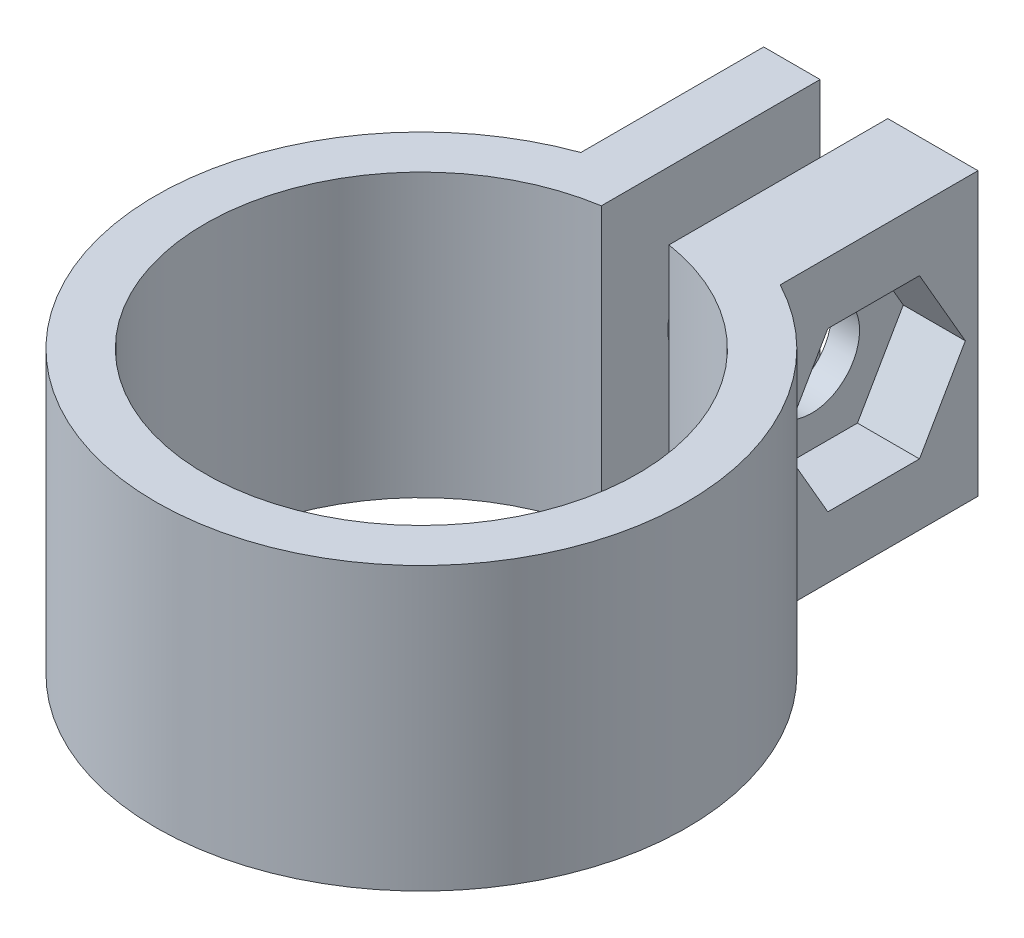
ISO-10303-21;
HEADER;
FILE_DESCRIPTION(('STEP AP214'),'2;1');
FILE_NAME('part.step','',(''),(''),'','','');
FILE_SCHEMA(('AUTOMOTIVE_DESIGN { 1 0 10303 214 1 1 1 1 }'));
ENDSEC;
DATA;
#1=APPLICATION_CONTEXT('core data for automotive mechanical design processes');
#2=APPLICATION_PROTOCOL_DEFINITION('international standard','automotive_design',2000,#1);
#3=PRODUCT_CONTEXT('',#1,'mechanical');
#4=PRODUCT('Part','Part','',(#3));
#5=PRODUCT_RELATED_PRODUCT_CATEGORY('part','',(#4));
#6=PRODUCT_DEFINITION_FORMATION('','',#4);
#7=PRODUCT_DEFINITION_CONTEXT('part definition',#1,'design');
#8=PRODUCT_DEFINITION('design','',#6,#7);
#9=PRODUCT_DEFINITION_SHAPE('','',#8);
#10=(LENGTH_UNIT() NAMED_UNIT(*) SI_UNIT(.MILLI.,.METRE.));
#11=(NAMED_UNIT(*) PLANE_ANGLE_UNIT() SI_UNIT($,.RADIAN.));
#12=(NAMED_UNIT(*) SI_UNIT($,.STERADIAN.) SOLID_ANGLE_UNIT());
#13=UNCERTAINTY_MEASURE_WITH_UNIT(LENGTH_MEASURE(1.E-05),#10,'distance_accuracy_value','');
#14=(GEOMETRIC_REPRESENTATION_CONTEXT(3) GLOBAL_UNCERTAINTY_ASSIGNED_CONTEXT((#13)) GLOBAL_UNIT_ASSIGNED_CONTEXT((#10,
#11,#12)) REPRESENTATION_CONTEXT('',''));
#15=CARTESIAN_POINT('',(0.,0.,0.));
#16=DIRECTION('',(0.,0.,1.));
#17=DIRECTION('',(1.,0.,0.));
#18=AXIS2_PLACEMENT_3D('',#15,#16,#17);
#19=CARTESIAN_POINT('',(0.,10.,0.));
#20=DIRECTION('',(0.,-1.,0.));
#21=DIRECTION('',(0.,0.,-1.));
#22=AXIS2_PLACEMENT_3D('',#19,#20,#21);
#23=CYLINDRICAL_SURFACE('',#22,9.415);
#24=CARTESIAN_POINT('',(-3.20000000000001,3.32266334273869,-8.85450309164777));
#25=CARTESIAN_POINT('',(-3.25054595508457,3.35298669138748,-8.83623795384005));
#26=CARTESIAN_POINT('',(-3.30019469485413,3.38469144272539,-8.81780291396599));
#27=CARTESIAN_POINT('',(-3.39746319620485,3.45111113295641,-8.78078449442234));
#28=CARTESIAN_POINT('',(-3.44508063995582,3.48582938026727,-8.76220097258393));
#29=CARTESIAN_POINT('',(-3.58572829051681,3.59583534816847,-8.70603386733257));
#30=CARTESIAN_POINT('',(-3.67505223024977,3.67609814594171,-8.6685823268921));
#31=CARTESIAN_POINT('',(-3.84078313057335,3.85144043410508,-8.5964435731321));
#32=CARTESIAN_POINT('',(-3.91709612437759,3.94661890671804,-8.56177735286647));
#33=CARTESIAN_POINT('',(-4.05084130179677,4.15084970714731,-8.49931501943328));
#34=CARTESIAN_POINT('',(-4.10839820785032,4.25980340930395,-8.47147384212029));
#35=CARTESIAN_POINT('',(-4.18569686465278,4.4535297664306,-8.43346997560956));
#36=CARTESIAN_POINT('',(-4.21163173927468,4.53529381341501,-8.42050218063141));
#37=CARTESIAN_POINT('',(-4.25088502798286,4.70260523306088,-8.40075550025931));
#38=CARTESIAN_POINT('',(-4.26420125340926,4.78815325934784,-8.39397768850337));
#39=CARTESIAN_POINT('',(-4.2773216553429,4.9607561709968,-8.38730016581237));
#40=CARTESIAN_POINT('',(-4.27709488251861,5.04781405325867,-8.38741620915566));
#41=CARTESIAN_POINT('',(-4.26307259467804,5.2205273333778,-8.39455147824911));
#42=CARTESIAN_POINT('',(-4.24927656546568,5.30618267796196,-8.40157096559973));
#43=CARTESIAN_POINT('',(-4.20970633214485,5.47083014084275,-8.42146413014954));
#44=CARTESIAN_POINT('',(-4.18434985362165,5.54994941980127,-8.43413333687166));
#45=CARTESIAN_POINT('',(-4.12319086115026,5.70301868452758,-8.46419993249979));
#46=CARTESIAN_POINT('',(-4.08738714837581,5.77696807583987,-8.48159786401403));
#47=CARTESIAN_POINT('',(-3.98981859831605,5.94883701376942,-8.52804600478352));
#48=CARTESIAN_POINT('',(-3.92347826198742,6.04366661682908,-8.55891232141778));
#49=CARTESIAN_POINT('',(-3.77684369814997,6.22055497491544,-8.62462461824936));
#50=CARTESIAN_POINT('',(-3.69649933964169,6.30256576989764,-8.6594847361683));
#51=CARTESIAN_POINT('',(-3.54723111918477,6.43494048300563,-8.72147657930072));
#52=CARTESIAN_POINT('',(-3.48057428161443,6.48805702124737,-8.74832759799038));
#53=CARTESIAN_POINT('',(-3.34317937130383,6.58748379960529,-8.80175175459164));
#54=CARTESIAN_POINT('',(-3.27248032209904,6.63384750775786,-8.82832533083191));
#55=CARTESIAN_POINT('',(-3.20000000000001,6.67733665726131,-8.85450309164777));
#56=B_SPLINE_CURVE_WITH_KNOTS('',3,(#24,#25,#26,#27,#28,#29,#30,#31,#32,#33,#34,#35,#36,#37,#38,
#39,#40,#41,#42,#43,#44,#45,#46,#47,#48,#49,#50,#51,#52,#53,#54,#55),.UNSPECIFIED.,.F.,.F.,(4,2,
2,2,2,2,2,2,2,2,2,2,2,2,2,4),(0.,0.1850829611416,0.370371753015485,0.746381534954159,
1.12500137692798,1.50104953977322,1.76022611431609,2.01944763389206,2.2792615657921,
2.53908534351154,2.79018540970542,3.04131430111838,3.39865528012095,3.75730275877797,
4.02504520273249,4.29053666169894),.UNSPECIFIED.);
#57=CARTESIAN_POINT('',(-3.2,3.32266334273869,-8.85450309164778));
#58=VERTEX_POINT('',#57);
#59=CARTESIAN_POINT('',(-3.2,6.67733665726131,-8.85450309164778));
#60=VERTEX_POINT('',#59);
#61=EDGE_CURVE('E162',#58,#60,#56,.T.);
#62=ORIENTED_EDGE('',*,*,#61,.F.);
#63=DIRECTION('',(0.,-1.,0.));
#64=VECTOR('',#63,1.);
#65=CARTESIAN_POINT('',(-3.2,10.,-8.85450309164778));
#66=LINE('',#65,#64);
#67=CARTESIAN_POINT('',(-3.2,0.,-8.85450309164777));
#68=VERTEX_POINT('',#67);
#69=EDGE_CURVE('E13',#68,#58,#66,.F.);
#70=ORIENTED_EDGE('',*,*,#69,.F.);
#71=CARTESIAN_POINT('',(0.,0.,0.));
#72=DIRECTION('',(0.,1.,0.));
#73=DIRECTION('',(1.,0.,0.));
#74=AXIS2_PLACEMENT_3D('',#71,#72,#73);
#75=CIRCLE('',#74,9.415);
#76=CARTESIAN_POINT('',(4.4,0.,-8.32359447594607));
#77=VERTEX_POINT('',#76);
#78=EDGE_CURVE('E221',#68,#77,#75,.T.);
#79=ORIENTED_EDGE('',*,*,#78,.T.);
#80=DIRECTION('',(0.,-1.,0.));
#81=VECTOR('',#80,1.);
#82=CARTESIAN_POINT('',(4.4,10.,-8.32359447594607));
#83=LINE('',#82,#81);
#84=CARTESIAN_POINT('',(4.4,10.,-8.32359447594607));
#85=VERTEX_POINT('',#84);
#86=EDGE_CURVE('E197',#85,#77,#83,.T.);
#87=ORIENTED_EDGE('',*,*,#86,.F.);
#88=CARTESIAN_POINT('',(0.,10.,0.));
#89=DIRECTION('',(0.,1.,0.));
#90=DIRECTION('',(1.,0.,0.));
#91=AXIS2_PLACEMENT_3D('',#88,#89,#90);
#92=CIRCLE('',#91,9.415);
#93=CARTESIAN_POINT('',(-3.2,10.,-8.85450309164777));
#94=VERTEX_POINT('',#93);
#95=EDGE_CURVE('E225',#94,#85,#92,.T.);
#96=ORIENTED_EDGE('',*,*,#95,.F.);
#97=EDGE_CURVE('E63',#60,#94,#66,.F.);
#98=ORIENTED_EDGE('',*,*,#97,.F.);
#99=EDGE_LOOP('',(#62,#70,#79,#87,#96,#98));
#100=FACE_BOUND('',#99,.T.);
#101=ADVANCED_FACE('F53',(#100),#23,.T.);
#102=CARTESIAN_POINT('',(-6.8,5.,-11.6382131588436));
#103=DIRECTION('',(1.,0.,0.));
#104=DIRECTION('',(0.,0.,-1.));
#105=AXIS2_PLACEMENT_3D('',#102,#103,#104);
#106=CYLINDRICAL_SURFACE('',#105,1.7);
#107=CARTESIAN_POINT('',(1.2,5.,-11.6382131588436));
#108=DIRECTION('',(1.,0.,0.));
#109=DIRECTION('',(0.,0.,-1.));
#110=AXIS2_PLACEMENT_3D('',#107,#108,#109);
#111=CIRCLE('',#110,1.7);
#112=CARTESIAN_POINT('',(1.2,5.,-13.3382131588436));
#113=VERTEX_POINT('',#112);
#114=EDGE_CURVE('E271',#113,#113,#111,.T.);
#115=ORIENTED_EDGE('',*,*,#114,.F.);
#116=EDGE_LOOP('',(#115));
#117=FACE_BOUND('',#116,.T.);
#118=CARTESIAN_POINT('',(2.2,5.,-11.6382131588436));
#119=DIRECTION('',(1.,0.,0.));
#120=DIRECTION('',(0.,0.,-1.));
#121=AXIS2_PLACEMENT_3D('',#118,#119,#120);
#122=CIRCLE('',#121,1.7);
#123=CARTESIAN_POINT('',(2.2,5.,-13.3382131588436));
#124=VERTEX_POINT('',#123);
#125=EDGE_CURVE('E57',#124,#124,#122,.F.);
#126=ORIENTED_EDGE('',*,*,#125,.F.);
#127=EDGE_LOOP('',(#126));
#128=FACE_BOUND('',#127,.T.);
#129=ADVANCED_FACE('F384',(#117,#128),#106,.F.);
#130=CARTESIAN_POINT('',(0.,10.,0.));
#131=DIRECTION('',(0.,1.,0.));
#132=DIRECTION('',(0.,0.,1.));
#133=AXIS2_PLACEMENT_3D('',#130,#131,#132);
#134=PLANE('',#133);
#135=DIRECTION('',(-1.,0.,0.));
#136=VECTOR('',#135,1.);
#137=CARTESIAN_POINT('',(3.2,10.,-15.3382131588436));
#138=LINE('',#137,#136);
#139=CARTESIAN_POINT('',(4.4,10.,-15.3382131588436));
#140=VERTEX_POINT('',#139);
#141=CARTESIAN_POINT('',(1.2,10.,-15.3382131588436));
#142=VERTEX_POINT('',#141);
#143=EDGE_CURVE('E248',#140,#142,#138,.T.);
#144=ORIENTED_EDGE('',*,*,#143,.T.);
#145=DIRECTION('',(0.,0.,-1.));
#146=VECTOR('',#145,1.);
#147=CARTESIAN_POINT('',(1.2,10.,-12.6734672461365));
#148=LINE('',#147,#146);
#149=CARTESIAN_POINT('',(1.2,10.,-7.58060848481176));
#150=VERTEX_POINT('',#149);
#151=EDGE_CURVE('E202',#150,#142,#148,.T.);
#152=ORIENTED_EDGE('',*,*,#151,.F.);
#153=CARTESIAN_POINT('',(0.,10.,0.));
#154=DIRECTION('',(0.,1.,0.));
#155=DIRECTION('',(0.,0.,1.));
#156=AXIS2_PLACEMENT_3D('',#153,#154,#155);
#157=CIRCLE('',#156,7.675);
#158=CARTESIAN_POINT('',(-1.2,10.,-7.58060848481176));
#159=VERTEX_POINT('',#158);
#160=EDGE_CURVE('E217',#159,#150,#157,.T.);
#161=ORIENTED_EDGE('',*,*,#160,.F.);
#162=DIRECTION('',(0.,0.,1.));
#163=VECTOR('',#162,1.);
#164=CARTESIAN_POINT('',(-1.2,10.,-12.6734672461365));
#165=LINE('',#164,#163);
#166=CARTESIAN_POINT('',(-1.2,10.,-15.3382131588436));
#167=VERTEX_POINT('',#166);
#168=EDGE_CURVE('E209',#167,#159,#165,.T.);
#169=ORIENTED_EDGE('',*,*,#168,.F.);
#170=DIRECTION('',(1.,0.,0.));
#171=VECTOR('',#170,1.);
#172=CARTESIAN_POINT('',(-3.2,10.,-15.3382131588436));
#173=LINE('',#172,#171);
#174=CARTESIAN_POINT('',(-3.2,10.,-15.3382131588436));
#175=VERTEX_POINT('',#174);
#176=EDGE_CURVE('E198',#175,#167,#173,.T.);
#177=ORIENTED_EDGE('',*,*,#176,.F.);
#178=DIRECTION('',(0.,0.,1.));
#179=VECTOR('',#178,1.);
#180=CARTESIAN_POINT('',(-3.2,10.,-15.3382131588436));
#181=LINE('',#180,#179);
#182=EDGE_CURVE('E183',#175,#94,#181,.T.);
#183=ORIENTED_EDGE('',*,*,#182,.T.);
#184=ORIENTED_EDGE('',*,*,#95,.T.);
#185=DIRECTION('',(0.,0.,1.));
#186=VECTOR('',#185,1.);
#187=CARTESIAN_POINT('',(4.4,10.,-15.3382131588436));
#188=LINE('',#187,#186);
#189=EDGE_CURVE('E238',#140,#85,#188,.T.);
#190=ORIENTED_EDGE('',*,*,#189,.F.);
#191=EDGE_LOOP('',(#144,#152,#161,#169,#177,#183,#184,#190));
#192=FACE_BOUND('',#191,.T.);
#193=ADVANCED_FACE('F406',(#192),#134,.T.);
#194=CARTESIAN_POINT('',(0.,0.,0.));
#195=DIRECTION('',(0.,1.,0.));
#196=DIRECTION('',(0.,0.,1.));
#197=AXIS2_PLACEMENT_3D('',#194,#195,#196);
#198=PLANE('',#197);
#199=DIRECTION('',(0.,0.,-1.));
#200=VECTOR('',#199,1.);
#201=CARTESIAN_POINT('',(1.2,0.,-12.6734672461365));
#202=LINE('',#201,#200);
#203=CARTESIAN_POINT('',(1.2,0.,-7.58060848481176));
#204=VERTEX_POINT('',#203);
#205=CARTESIAN_POINT('',(1.2,0.,-15.3382131588436));
#206=VERTEX_POINT('',#205);
#207=EDGE_CURVE('E205',#204,#206,#202,.T.);
#208=ORIENTED_EDGE('',*,*,#207,.T.);
#209=DIRECTION('',(-1.,0.,0.));
#210=VECTOR('',#209,1.);
#211=CARTESIAN_POINT('',(3.2,0.,-15.3382131588436));
#212=LINE('',#211,#210);
#213=CARTESIAN_POINT('',(4.4,0.,-15.3382131588436));
#214=VERTEX_POINT('',#213);
#215=EDGE_CURVE('E251',#214,#206,#212,.T.);
#216=ORIENTED_EDGE('',*,*,#215,.F.);
#217=DIRECTION('',(0.,0.,-1.));
#218=VECTOR('',#217,1.);
#219=CARTESIAN_POINT('',(4.4,0.,-15.3382131588436));
#220=LINE('',#219,#218);
#221=EDGE_CURVE('E246',#77,#214,#220,.T.);
#222=ORIENTED_EDGE('',*,*,#221,.F.);
#223=ORIENTED_EDGE('',*,*,#78,.F.);
#224=DIRECTION('',(0.,0.,-1.));
#225=VECTOR('',#224,1.);
#226=CARTESIAN_POINT('',(-3.2,0.,-8.45941082182769));
#227=LINE('',#226,#225);
#228=CARTESIAN_POINT('',(-3.2,0.,-15.3382131588436));
#229=VERTEX_POINT('',#228);
#230=EDGE_CURVE('E175',#68,#229,#227,.T.);
#231=ORIENTED_EDGE('',*,*,#230,.T.);
#232=DIRECTION('',(1.,0.,0.));
#233=VECTOR('',#232,1.);
#234=CARTESIAN_POINT('',(-3.2,0.,-15.3382131588436));
#235=LINE('',#234,#233);
#236=CARTESIAN_POINT('',(-1.2,0.,-15.3382131588436));
#237=VERTEX_POINT('',#236);
#238=EDGE_CURVE('E187',#229,#237,#235,.T.);
#239=ORIENTED_EDGE('',*,*,#238,.T.);
#240=DIRECTION('',(0.,0.,1.));
#241=VECTOR('',#240,1.);
#242=CARTESIAN_POINT('',(-1.2,0.,-12.6734672461365));
#243=LINE('',#242,#241);
#244=CARTESIAN_POINT('',(-1.2,0.,-7.58060848481176));
#245=VERTEX_POINT('',#244);
#246=EDGE_CURVE('E208',#237,#245,#243,.T.);
#247=ORIENTED_EDGE('',*,*,#246,.T.);
#248=CARTESIAN_POINT('',(0.,0.,0.));
#249=DIRECTION('',(0.,1.,0.));
#250=DIRECTION('',(0.,0.,1.));
#251=AXIS2_PLACEMENT_3D('',#248,#249,#250);
#252=CIRCLE('',#251,7.675);
#253=EDGE_CURVE('E212',#245,#204,#252,.T.);
#254=ORIENTED_EDGE('',*,*,#253,.T.);
#255=EDGE_LOOP('',(#208,#216,#222,#223,#231,#239,#247,#254));
#256=FACE_BOUND('',#255,.T.);
#257=ADVANCED_FACE('F404',(#256),#198,.F.);
#258=CARTESIAN_POINT('',(0.,10.,0.));
#259=DIRECTION('',(0.,-1.,0.));
#260=DIRECTION('',(0.,0.,-1.));
#261=AXIS2_PLACEMENT_3D('',#258,#259,#260);
#262=CYLINDRICAL_SURFACE('',#261,7.675);
#263=DIRECTION('',(0.,-1.,0.));
#264=VECTOR('',#263,1.);
#265=CARTESIAN_POINT('',(1.2,10.,-7.58060848481176));
#266=LINE('',#265,#264);
#267=EDGE_CURVE('E235',#204,#150,#266,.F.);
#268=ORIENTED_EDGE('',*,*,#267,.F.);
#269=ORIENTED_EDGE('',*,*,#253,.F.);
#270=DIRECTION('',(0.,-1.,0.));
#271=VECTOR('',#270,1.);
#272=CARTESIAN_POINT('',(-1.2,10.,-7.58060848481176));
#273=LINE('',#272,#271);
#274=EDGE_CURVE('E229',#159,#245,#273,.T.);
#275=ORIENTED_EDGE('',*,*,#274,.F.);
#276=ORIENTED_EDGE('',*,*,#160,.T.);
#277=EDGE_LOOP('',(#268,#269,#275,#276));
#278=FACE_BOUND('',#277,.T.);
#279=ADVANCED_FACE('F397',(#278),#262,.F.);
#280=CARTESIAN_POINT('',(-1.2,0.,-12.6734672461365));
#281=DIRECTION('',(-1.,0.,0.));
#282=DIRECTION('',(0.,0.,1.));
#283=AXIS2_PLACEMENT_3D('',#280,#281,#282);
#284=PLANE('',#283);
#285=CARTESIAN_POINT('',(-1.2,5.,-11.6382131588436));
#286=DIRECTION('',(-1.,0.,0.));
#287=DIRECTION('',(0.,0.,1.));
#288=AXIS2_PLACEMENT_3D('',#285,#286,#287);
#289=CIRCLE('',#288,1.7);
#290=CARTESIAN_POINT('',(-1.2,5.,-9.93821315884361));
#291=VERTEX_POINT('',#290);
#292=EDGE_CURVE('E267',#291,#291,#289,.T.);
#293=ORIENTED_EDGE('',*,*,#292,.T.);
#294=EDGE_LOOP('',(#293));
#295=FACE_BOUND('',#294,.T.);
#296=ORIENTED_EDGE('',*,*,#274,.T.);
#297=ORIENTED_EDGE('',*,*,#246,.F.);
#298=DIRECTION('',(0.,1.,0.));
#299=VECTOR('',#298,1.);
#300=CARTESIAN_POINT('',(-1.2,0.,-15.3382131588436));
#301=LINE('',#300,#299);
#302=EDGE_CURVE('E190',#237,#167,#301,.T.);
#303=ORIENTED_EDGE('',*,*,#302,.T.);
#304=ORIENTED_EDGE('',*,*,#168,.T.);
#305=EDGE_LOOP('',(#296,#297,#303,#304));
#306=FACE_BOUND('',#305,.T.);
#307=ADVANCED_FACE('F394',(#295,#306),#284,.F.);
#308=CARTESIAN_POINT('',(1.2,0.,-12.6734672461365));
#309=DIRECTION('',(1.,0.,0.));
#310=DIRECTION('',(0.,0.,-1.));
#311=AXIS2_PLACEMENT_3D('',#308,#309,#310);
#312=PLANE('',#311);
#313=ORIENTED_EDGE('',*,*,#114,.T.);
#314=EDGE_LOOP('',(#313));
#315=FACE_BOUND('',#314,.T.);
#316=DIRECTION('',(0.,1.,0.));
#317=VECTOR('',#316,1.);
#318=CARTESIAN_POINT('',(1.2,0.,-15.3382131588436));
#319=LINE('',#318,#317);
#320=EDGE_CURVE('E243',#206,#142,#319,.T.);
#321=ORIENTED_EDGE('',*,*,#320,.F.);
#322=ORIENTED_EDGE('',*,*,#207,.F.);
#323=ORIENTED_EDGE('',*,*,#267,.T.);
#324=ORIENTED_EDGE('',*,*,#151,.T.);
#325=EDGE_LOOP('',(#321,#322,#323,#324));
#326=FACE_BOUND('',#325,.T.);
#327=ADVANCED_FACE('F390',(#315,#326),#312,.F.);
#328=CARTESIAN_POINT('',(-3.2,0.,0.));
#329=DIRECTION('',(1.,0.,0.));
#330=DIRECTION('',(0.,0.,-1.));
#331=AXIS2_PLACEMENT_3D('',#328,#329,#330);
#332=PLANE('',#331);
#333=ORIENTED_EDGE('',*,*,#69,.T.);
#334=CARTESIAN_POINT('',(-3.2,5.,-11.6382131588436));
#335=DIRECTION('',(-1.,0.,0.));
#336=DIRECTION('',(0.,0.,1.));
#337=AXIS2_PLACEMENT_3D('',#334,#335,#336);
#338=CIRCLE('',#337,3.25);
#339=EDGE_CURVE('E70',#58,#60,#338,.T.);
#340=ORIENTED_EDGE('',*,*,#339,.T.);
#341=ORIENTED_EDGE('',*,*,#97,.T.);
#342=ORIENTED_EDGE('',*,*,#182,.F.);
#343=DIRECTION('',(0.,1.,0.));
#344=VECTOR('',#343,1.);
#345=CARTESIAN_POINT('',(-3.2,0.,-15.3382131588436));
#346=LINE('',#345,#344);
#347=EDGE_CURVE('E178',#229,#175,#346,.T.);
#348=ORIENTED_EDGE('',*,*,#347,.F.);
#349=ORIENTED_EDGE('',*,*,#230,.F.);
#350=EDGE_LOOP('',(#333,#340,#341,#342,#348,#349));
#351=FACE_BOUND('',#350,.T.);
#352=CARTESIAN_POINT('',(-3.2,5.,-11.6382131588436));
#353=DIRECTION('',(1.,0.,0.));
#354=DIRECTION('',(0.,0.,-1.));
#355=AXIS2_PLACEMENT_3D('',#352,#353,#354);
#356=CIRCLE('',#355,1.7);
#357=CARTESIAN_POINT('',(-3.2,5.,-13.3382131588436));
#358=VERTEX_POINT('',#357);
#359=EDGE_CURVE('E275',#358,#358,#356,.T.);
#360=ORIENTED_EDGE('',*,*,#359,.T.);
#361=EDGE_LOOP('',(#360));
#362=FACE_BOUND('',#361,.T.);
#363=ADVANCED_FACE('F172',(#351,#362),#332,.F.);
#364=CARTESIAN_POINT('',(-3.2,0.,-15.3382131588436));
#365=DIRECTION('',(0.,0.,-1.));
#366=DIRECTION('',(-1.,0.,0.));
#367=AXIS2_PLACEMENT_3D('',#364,#365,#366);
#368=PLANE('',#367);
#369=ORIENTED_EDGE('',*,*,#302,.F.);
#370=ORIENTED_EDGE('',*,*,#238,.F.);
#371=ORIENTED_EDGE('',*,*,#347,.T.);
#372=ORIENTED_EDGE('',*,*,#176,.T.);
#373=EDGE_LOOP('',(#369,#370,#371,#372));
#374=FACE_BOUND('',#373,.T.);
#375=ADVANCED_FACE('F389',(#374),#368,.T.);
#376=CARTESIAN_POINT('',(4.4,0.,0.));
#377=DIRECTION('',(-1.,0.,0.));
#378=DIRECTION('',(0.,0.,-1.));
#379=AXIS2_PLACEMENT_3D('',#376,#377,#378);
#380=PLANE('',#379);
#381=DIRECTION('',(0.,0.866025403784438,0.5));
#382=VECTOR('',#381,1.);
#383=CARTESIAN_POINT('',(4.4,5.,-14.8882131588436));
#384=LINE('',#383,#382);
#385=CARTESIAN_POINT('',(4.4,5.,-14.8882131588436));
#386=VERTEX_POINT('',#385);
#387=CARTESIAN_POINT('',(4.4,7.81458256229942,-13.2632131588436));
#388=VERTEX_POINT('',#387);
#389=EDGE_CURVE('E315',#386,#388,#384,.T.);
#390=ORIENTED_EDGE('',*,*,#389,.F.);
#391=DIRECTION('',(0.,0.866025403784439,-0.5));
#392=VECTOR('',#391,1.);
#393=CARTESIAN_POINT('',(4.4,2.18541743770058,-13.2632131588436));
#394=LINE('',#393,#392);
#395=CARTESIAN_POINT('',(4.4,2.18541743770058,-13.2632131588436));
#396=VERTEX_POINT('',#395);
#397=EDGE_CURVE('E78',#396,#386,#394,.T.);
#398=ORIENTED_EDGE('',*,*,#397,.F.);
#399=DIRECTION('',(0.,0.,-1.));
#400=VECTOR('',#399,1.);
#401=CARTESIAN_POINT('',(4.4,2.18541743770058,-10.0132131588436));
#402=LINE('',#401,#400);
#403=CARTESIAN_POINT('',(4.4,2.18541743770058,-10.0132131588436));
#404=VERTEX_POINT('',#403);
#405=EDGE_CURVE('E298',#404,#396,#402,.T.);
#406=ORIENTED_EDGE('',*,*,#405,.F.);
#407=DIRECTION('',(0.,-0.866025403784438,-0.5));
#408=VECTOR('',#407,1.);
#409=CARTESIAN_POINT('',(4.4,5.,-8.38821315884362));
#410=LINE('',#409,#408);
#411=CARTESIAN_POINT('',(4.4,5.,-8.38821315884362));
#412=VERTEX_POINT('',#411);
#413=EDGE_CURVE('E303',#412,#404,#410,.T.);
#414=ORIENTED_EDGE('',*,*,#413,.F.);
#415=DIRECTION('',(0.,-0.866025403784439,0.5));
#416=VECTOR('',#415,1.);
#417=CARTESIAN_POINT('',(4.4,7.81458256229942,-10.0132131588436));
#418=LINE('',#417,#416);
#419=CARTESIAN_POINT('',(4.4,7.81458256229942,-10.0132131588436));
#420=VERTEX_POINT('',#419);
#421=EDGE_CURVE('E307',#420,#412,#418,.T.);
#422=ORIENTED_EDGE('',*,*,#421,.F.);
#423=DIRECTION('',(0.,0.,1.));
#424=VECTOR('',#423,1.);
#425=CARTESIAN_POINT('',(4.4,7.81458256229942,-13.2632131588436));
#426=LINE('',#425,#424);
#427=EDGE_CURVE('E311',#388,#420,#426,.T.);
#428=ORIENTED_EDGE('',*,*,#427,.F.);
#429=EDGE_LOOP('',(#390,#398,#406,#414,#422,#428));
#430=FACE_BOUND('',#429,.T.);
#431=ORIENTED_EDGE('',*,*,#189,.T.);
#432=ORIENTED_EDGE('',*,*,#86,.T.);
#433=ORIENTED_EDGE('',*,*,#221,.T.);
#434=DIRECTION('',(0.,1.,0.));
#435=VECTOR('',#434,1.);
#436=CARTESIAN_POINT('',(4.4,0.,-15.3382131588436));
#437=LINE('',#436,#435);
#438=EDGE_CURVE('E242',#214,#140,#437,.T.);
#439=ORIENTED_EDGE('',*,*,#438,.T.);
#440=EDGE_LOOP('',(#431,#432,#433,#439));
#441=FACE_BOUND('',#440,.T.);
#442=ADVANCED_FACE('F55',(#430,#441),#380,.F.);
#443=CARTESIAN_POINT('',(3.2,0.,-15.3382131588436));
#444=DIRECTION('',(0.,0.,1.));
#445=DIRECTION('',(1.,0.,0.));
#446=AXIS2_PLACEMENT_3D('',#443,#444,#445);
#447=PLANE('',#446);
#448=ORIENTED_EDGE('',*,*,#320,.T.);
#449=ORIENTED_EDGE('',*,*,#143,.F.);
#450=ORIENTED_EDGE('',*,*,#438,.F.);
#451=ORIENTED_EDGE('',*,*,#215,.T.);
#452=EDGE_LOOP('',(#448,#449,#450,#451));
#453=FACE_BOUND('',#452,.T.);
#454=ADVANCED_FACE('F382',(#453),#447,.F.);
#455=ORIENTED_EDGE('',*,*,#359,.F.);
#456=EDGE_LOOP('',(#455));
#457=FACE_BOUND('',#456,.T.);
#458=ORIENTED_EDGE('',*,*,#292,.F.);
#459=EDGE_LOOP('',(#458));
#460=FACE_BOUND('',#459,.T.);
#461=ADVANCED_FACE('F357',(#457,#460),#106,.F.);
#462=CARTESIAN_POINT('',(2.2,0.,0.));
#463=DIRECTION('',(1.,0.,0.));
#464=DIRECTION('',(0.,0.,-1.));
#465=AXIS2_PLACEMENT_3D('',#462,#463,#464);
#466=PLANE('',#465);
#467=DIRECTION('',(0.,0.866025403784439,-0.5));
#468=VECTOR('',#467,1.);
#469=CARTESIAN_POINT('',(2.2,2.18541743770058,-13.2632131588436));
#470=LINE('',#469,#468);
#471=CARTESIAN_POINT('',(2.2,2.18541743770058,-13.2632131588436));
#472=VERTEX_POINT('',#471);
#473=CARTESIAN_POINT('',(2.2,5.,-14.8882131588436));
#474=VERTEX_POINT('',#473);
#475=EDGE_CURVE('E302',#472,#474,#470,.T.);
#476=ORIENTED_EDGE('',*,*,#475,.T.);
#477=DIRECTION('',(0.,0.866025403784438,0.5));
#478=VECTOR('',#477,1.);
#479=CARTESIAN_POINT('',(2.2,5.,-14.8882131588436));
#480=LINE('',#479,#478);
#481=CARTESIAN_POINT('',(2.2,7.81458256229942,-13.2632131588436));
#482=VERTEX_POINT('',#481);
#483=EDGE_CURVE('E336',#474,#482,#480,.T.);
#484=ORIENTED_EDGE('',*,*,#483,.T.);
#485=DIRECTION('',(0.,0.,1.));
#486=VECTOR('',#485,1.);
#487=CARTESIAN_POINT('',(2.2,7.81458256229942,-13.2632131588436));
#488=LINE('',#487,#486);
#489=CARTESIAN_POINT('',(2.2,7.81458256229942,-10.0132131588436));
#490=VERTEX_POINT('',#489);
#491=EDGE_CURVE('E332',#482,#490,#488,.T.);
#492=ORIENTED_EDGE('',*,*,#491,.T.);
#493=DIRECTION('',(0.,-0.866025403784439,0.5));
#494=VECTOR('',#493,1.);
#495=CARTESIAN_POINT('',(2.2,7.81458256229942,-10.0132131588436));
#496=LINE('',#495,#494);
#497=CARTESIAN_POINT('',(2.2,5.,-8.38821315884362));
#498=VERTEX_POINT('',#497);
#499=EDGE_CURVE('E328',#490,#498,#496,.T.);
#500=ORIENTED_EDGE('',*,*,#499,.T.);
#501=DIRECTION('',(0.,-0.866025403784438,-0.5));
#502=VECTOR('',#501,1.);
#503=CARTESIAN_POINT('',(2.2,5.,-8.38821315884362));
#504=LINE('',#503,#502);
#505=CARTESIAN_POINT('',(2.2,2.18541743770058,-10.0132131588436));
#506=VERTEX_POINT('',#505);
#507=EDGE_CURVE('E324',#498,#506,#504,.T.);
#508=ORIENTED_EDGE('',*,*,#507,.T.);
#509=DIRECTION('',(0.,0.,-1.));
#510=VECTOR('',#509,1.);
#511=CARTESIAN_POINT('',(2.2,2.18541743770058,-10.0132131588436));
#512=LINE('',#511,#510);
#513=EDGE_CURVE('E283',#506,#472,#512,.T.);
#514=ORIENTED_EDGE('',*,*,#513,.T.);
#515=EDGE_LOOP('',(#476,#484,#492,#500,#508,#514));
#516=FACE_BOUND('',#515,.T.);
#517=ORIENTED_EDGE('',*,*,#125,.T.);
#518=EDGE_LOOP('',(#517));
#519=FACE_BOUND('',#518,.T.);
#520=ADVANCED_FACE('F353',(#516,#519),#466,.T.);
#521=CARTESIAN_POINT('',(2.2,2.18541743770058,-13.2632131588436));
#522=DIRECTION('',(0.,-0.5,-0.866025403784439));
#523=DIRECTION('',(0.,0.866025403784439,-0.5));
#524=AXIS2_PLACEMENT_3D('',#521,#522,#523);
#525=PLANE('',#524);
#526=ORIENTED_EDGE('',*,*,#397,.T.);
#527=DIRECTION('',(1.,0.,0.));
#528=VECTOR('',#527,1.);
#529=CARTESIAN_POINT('',(2.2,5.,-14.8882131588436));
#530=LINE('',#529,#528);
#531=EDGE_CURVE('E279',#474,#386,#530,.T.);
#532=ORIENTED_EDGE('',*,*,#531,.F.);
#533=ORIENTED_EDGE('',*,*,#475,.F.);
#534=DIRECTION('',(1.,0.,0.));
#535=VECTOR('',#534,1.);
#536=CARTESIAN_POINT('',(2.2,2.18541743770058,-13.2632131588436));
#537=LINE('',#536,#535);
#538=EDGE_CURVE('E295',#472,#396,#537,.T.);
#539=ORIENTED_EDGE('',*,*,#538,.T.);
#540=EDGE_LOOP('',(#526,#532,#533,#539));
#541=FACE_BOUND('',#540,.T.);
#542=ADVANCED_FACE('F356',(#541),#525,.F.);
#543=CARTESIAN_POINT('',(2.2,2.18541743770058,-10.0132131588436));
#544=DIRECTION('',(0.,-1.,0.));
#545=DIRECTION('',(0.,0.,-1.));
#546=AXIS2_PLACEMENT_3D('',#543,#544,#545);
#547=PLANE('',#546);
#548=ORIENTED_EDGE('',*,*,#405,.T.);
#549=ORIENTED_EDGE('',*,*,#538,.F.);
#550=ORIENTED_EDGE('',*,*,#513,.F.);
#551=DIRECTION('',(1.,0.,0.));
#552=VECTOR('',#551,1.);
#553=CARTESIAN_POINT('',(2.2,2.18541743770058,-10.0132131588436));
#554=LINE('',#553,#552);
#555=EDGE_CURVE('E292',#506,#404,#554,.T.);
#556=ORIENTED_EDGE('',*,*,#555,.T.);
#557=EDGE_LOOP('',(#548,#549,#550,#556));
#558=FACE_BOUND('',#557,.T.);
#559=ADVANCED_FACE('F359',(#558),#547,.F.);
#560=CARTESIAN_POINT('',(2.2,5.,-8.38821315884362));
#561=DIRECTION('',(0.,-0.5,0.866025403784438));
#562=DIRECTION('',(0.,-0.866025403784438,-0.5));
#563=AXIS2_PLACEMENT_3D('',#560,#561,#562);
#564=PLANE('',#563);
#565=ORIENTED_EDGE('',*,*,#413,.T.);
#566=ORIENTED_EDGE('',*,*,#555,.F.);
#567=ORIENTED_EDGE('',*,*,#507,.F.);
#568=DIRECTION('',(1.,0.,0.));
#569=VECTOR('',#568,1.);
#570=CARTESIAN_POINT('',(2.2,5.,-8.38821315884362));
#571=LINE('',#570,#569);
#572=EDGE_CURVE('E289',#498,#412,#571,.T.);
#573=ORIENTED_EDGE('',*,*,#572,.T.);
#574=EDGE_LOOP('',(#565,#566,#567,#573));
#575=FACE_BOUND('',#574,.T.);
#576=ADVANCED_FACE('F362',(#575),#564,.F.);
#577=CARTESIAN_POINT('',(2.2,7.81458256229942,-10.0132131588436));
#578=DIRECTION('',(0.,0.5,0.866025403784438));
#579=DIRECTION('',(0.,-0.866025403784439,0.5));
#580=AXIS2_PLACEMENT_3D('',#577,#578,#579);
#581=PLANE('',#580);
#582=ORIENTED_EDGE('',*,*,#421,.T.);
#583=ORIENTED_EDGE('',*,*,#572,.F.);
#584=ORIENTED_EDGE('',*,*,#499,.F.);
#585=DIRECTION('',(1.,0.,0.));
#586=VECTOR('',#585,1.);
#587=CARTESIAN_POINT('',(2.2,7.81458256229942,-10.0132131588436));
#588=LINE('',#587,#586);
#589=EDGE_CURVE('E286',#490,#420,#588,.T.);
#590=ORIENTED_EDGE('',*,*,#589,.T.);
#591=EDGE_LOOP('',(#582,#583,#584,#590));
#592=FACE_BOUND('',#591,.T.);
#593=ADVANCED_FACE('F366',(#592),#581,.F.);
#594=CARTESIAN_POINT('',(2.2,7.81458256229942,-13.2632131588436));
#595=DIRECTION('',(0.,1.,0.));
#596=DIRECTION('',(0.,0.,1.));
#597=AXIS2_PLACEMENT_3D('',#594,#595,#596);
#598=PLANE('',#597);
#599=ORIENTED_EDGE('',*,*,#427,.T.);
#600=ORIENTED_EDGE('',*,*,#589,.F.);
#601=ORIENTED_EDGE('',*,*,#491,.F.);
#602=DIRECTION('',(1.,0.,0.));
#603=VECTOR('',#602,1.);
#604=CARTESIAN_POINT('',(2.2,7.81458256229942,-13.2632131588436));
#605=LINE('',#604,#603);
#606=EDGE_CURVE('E282',#482,#388,#605,.T.);
#607=ORIENTED_EDGE('',*,*,#606,.T.);
#608=EDGE_LOOP('',(#599,#600,#601,#607));
#609=FACE_BOUND('',#608,.T.);
#610=ADVANCED_FACE('F370',(#609),#598,.F.);
#611=CARTESIAN_POINT('',(2.2,5.,-14.8882131588436));
#612=DIRECTION('',(0.,0.5,-0.866025403784439));
#613=DIRECTION('',(0.,0.866025403784438,0.5));
#614=AXIS2_PLACEMENT_3D('',#611,#612,#613);
#615=PLANE('',#614);
#616=ORIENTED_EDGE('',*,*,#389,.T.);
#617=ORIENTED_EDGE('',*,*,#606,.F.);
#618=ORIENTED_EDGE('',*,*,#483,.F.);
#619=ORIENTED_EDGE('',*,*,#531,.T.);
#620=EDGE_LOOP('',(#616,#617,#618,#619));
#621=FACE_BOUND('',#620,.T.);
#622=ADVANCED_FACE('F352',(#621),#615,.F.);
#623=CARTESIAN_POINT('',(-6.2,5.,-11.6382131588436));
#624=DIRECTION('',(1.,0.,0.));
#625=DIRECTION('',(0.,0.,-1.));
#626=AXIS2_PLACEMENT_3D('',#623,#624,#625);
#627=CYLINDRICAL_SURFACE('',#626,3.25);
#628=ORIENTED_EDGE('',*,*,#61,.T.);
#629=ORIENTED_EDGE('',*,*,#339,.F.);
#630=EDGE_LOOP('',(#628,#629));
#631=FACE_BOUND('',#630,.T.);
#632=ADVANCED_FACE('F161',(#631),#627,.F.);
#633=CLOSED_SHELL('',(#101,#129,#193,#257,#279,#307,#327,#363,#375,#442,#454,#461,#520,#542,
#559,#576,#593,#610,#622,#632));
#634=MANIFOLD_SOLID_BREP('B2',#633);
#635=ADVANCED_BREP_SHAPE_REPRESENTATION('',(#18,#634),#14);
#636=SHAPE_DEFINITION_REPRESENTATION(#9,#635);
ENDSEC;
END-ISO-10303-21;
